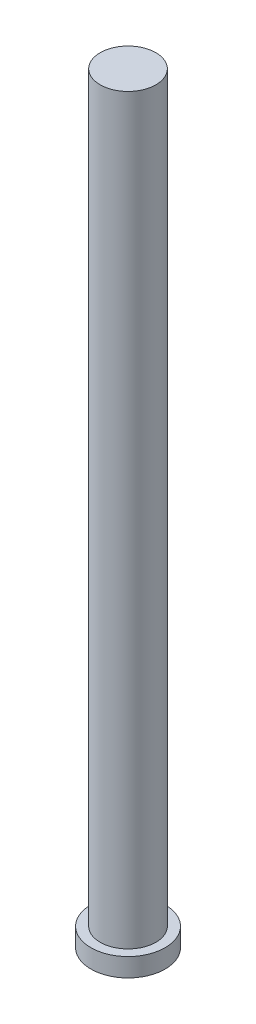
ISO-10303-21;
HEADER;
FILE_DESCRIPTION(('STEP AP214'),'2;1');
FILE_NAME('part.step','',(''),(''),'','','');
FILE_SCHEMA(('AUTOMOTIVE_DESIGN { 1 0 10303 214 1 1 1 1 }'));
ENDSEC;
DATA;
#1=APPLICATION_CONTEXT('core data for automotive mechanical design processes');
#2=APPLICATION_PROTOCOL_DEFINITION('international standard','automotive_design',2000,#1);
#3=PRODUCT_CONTEXT('',#1,'mechanical');
#4=PRODUCT('Part','Part','',(#3));
#5=PRODUCT_RELATED_PRODUCT_CATEGORY('part','',(#4));
#6=PRODUCT_DEFINITION_FORMATION('','',#4);
#7=PRODUCT_DEFINITION_CONTEXT('part definition',#1,'design');
#8=PRODUCT_DEFINITION('design','',#6,#7);
#9=PRODUCT_DEFINITION_SHAPE('','',#8);
#10=(LENGTH_UNIT() NAMED_UNIT(*) SI_UNIT(.MILLI.,.METRE.));
#11=(NAMED_UNIT(*) PLANE_ANGLE_UNIT() SI_UNIT($,.RADIAN.));
#12=(NAMED_UNIT(*) SI_UNIT($,.STERADIAN.) SOLID_ANGLE_UNIT());
#13=UNCERTAINTY_MEASURE_WITH_UNIT(LENGTH_MEASURE(1.E-05),#10,'distance_accuracy_value','');
#14=(GEOMETRIC_REPRESENTATION_CONTEXT(3) GLOBAL_UNCERTAINTY_ASSIGNED_CONTEXT((#13)) GLOBAL_UNIT_ASSIGNED_CONTEXT((#10,
#11,#12)) REPRESENTATION_CONTEXT('',''));
#15=CARTESIAN_POINT('',(0.,0.,0.));
#16=DIRECTION('',(0.,0.,1.));
#17=DIRECTION('',(1.,0.,0.));
#18=AXIS2_PLACEMENT_3D('',#15,#16,#17);
#19=CARTESIAN_POINT('',(0.,40.,0.));
#20=DIRECTION('',(0.,-1.,0.));
#21=DIRECTION('',(0.,0.,-1.));
#22=AXIS2_PLACEMENT_3D('',#19,#20,#21);
#23=CYLINDRICAL_SURFACE('',#22,1.5);
#24=CARTESIAN_POINT('',(0.,40.,0.));
#25=DIRECTION('',(0.,1.,0.));
#26=DIRECTION('',(0.,0.,1.));
#27=AXIS2_PLACEMENT_3D('',#24,#25,#26);
#28=CIRCLE('',#27,1.5);
#29=CARTESIAN_POINT('',(0.,40.,1.5));
#30=VERTEX_POINT('',#29);
#31=EDGE_CURVE('E10',#30,#30,#28,.T.);
#32=ORIENTED_EDGE('',*,*,#31,.F.);
#33=EDGE_LOOP('',(#32));
#34=FACE_BOUND('',#33,.T.);
#35=CARTESIAN_POINT('',(0.,0.,0.));
#36=DIRECTION('',(0.,1.,0.));
#37=DIRECTION('',(0.,0.,1.));
#38=AXIS2_PLACEMENT_3D('',#35,#36,#37);
#39=CIRCLE('',#38,1.5);
#40=CARTESIAN_POINT('',(0.,0.,1.5));
#41=VERTEX_POINT('',#40);
#42=EDGE_CURVE('E46',#41,#41,#39,.T.);
#43=ORIENTED_EDGE('',*,*,#42,.T.);
#44=EDGE_LOOP('',(#43));
#45=FACE_BOUND('',#44,.T.);
#46=ADVANCED_FACE('F43',(#34,#45),#23,.T.);
#47=CARTESIAN_POINT('',(0.,40.,0.));
#48=DIRECTION('',(0.,1.,0.));
#49=DIRECTION('',(0.,0.,1.));
#50=AXIS2_PLACEMENT_3D('',#47,#48,#49);
#51=PLANE('',#50);
#52=ORIENTED_EDGE('',*,*,#31,.T.);
#53=EDGE_LOOP('',(#52));
#54=FACE_BOUND('',#53,.T.);
#55=ADVANCED_FACE('F69',(#54),#51,.T.);
#56=CARTESIAN_POINT('',(0.,-1.,0.));
#57=DIRECTION('',(0.,1.,0.));
#58=DIRECTION('',(0.,0.,1.));
#59=AXIS2_PLACEMENT_3D('',#56,#57,#58);
#60=CYLINDRICAL_SURFACE('',#59,2.);
#61=CARTESIAN_POINT('',(0.,-1.,0.));
#62=DIRECTION('',(0.,-1.,0.));
#63=DIRECTION('',(0.,0.,-1.));
#64=AXIS2_PLACEMENT_3D('',#61,#62,#63);
#65=CIRCLE('',#64,2.);
#66=CARTESIAN_POINT('',(0.,-1.,-2.));
#67=VERTEX_POINT('',#66);
#68=EDGE_CURVE('E54',#67,#67,#65,.T.);
#69=ORIENTED_EDGE('',*,*,#68,.F.);
#70=EDGE_LOOP('',(#69));
#71=FACE_BOUND('',#70,.T.);
#72=CARTESIAN_POINT('',(0.,0.,0.));
#73=DIRECTION('',(0.,-1.,0.));
#74=DIRECTION('',(0.,0.,-1.));
#75=AXIS2_PLACEMENT_3D('',#72,#73,#74);
#76=CIRCLE('',#75,2.);
#77=CARTESIAN_POINT('',(0.,0.,-2.));
#78=VERTEX_POINT('',#77);
#79=EDGE_CURVE('E60',#78,#78,#76,.T.);
#80=ORIENTED_EDGE('',*,*,#79,.T.);
#81=EDGE_LOOP('',(#80));
#82=FACE_BOUND('',#81,.T.);
#83=ADVANCED_FACE('F70',(#71,#82),#60,.T.);
#84=CARTESIAN_POINT('',(0.,-1.,0.));
#85=DIRECTION('',(0.,-1.,0.));
#86=DIRECTION('',(0.,0.,-1.));
#87=AXIS2_PLACEMENT_3D('',#84,#85,#86);
#88=PLANE('',#87);
#89=ORIENTED_EDGE('',*,*,#68,.T.);
#90=EDGE_LOOP('',(#89));
#91=FACE_BOUND('',#90,.T.);
#92=ADVANCED_FACE('F63',(#91),#88,.T.);
#93=CARTESIAN_POINT('',(0.,0.,0.));
#94=DIRECTION('',(0.,-1.,0.));
#95=DIRECTION('',(0.,0.,-1.));
#96=AXIS2_PLACEMENT_3D('',#93,#94,#95);
#97=PLANE('',#96);
#98=ORIENTED_EDGE('',*,*,#42,.F.);
#99=EDGE_LOOP('',(#98));
#100=FACE_BOUND('',#99,.T.);
#101=ORIENTED_EDGE('',*,*,#79,.F.);
#102=EDGE_LOOP('',(#101));
#103=FACE_BOUND('',#102,.T.);
#104=ADVANCED_FACE('F74',(#100,#103),#97,.F.);
#105=CLOSED_SHELL('',(#46,#55,#83,#92,#104));
#106=MANIFOLD_SOLID_BREP('B2',#105);
#107=ADVANCED_BREP_SHAPE_REPRESENTATION('',(#18,#106),#14);
#108=SHAPE_DEFINITION_REPRESENTATION(#9,#107);
ENDSEC;
END-ISO-10303-21;
